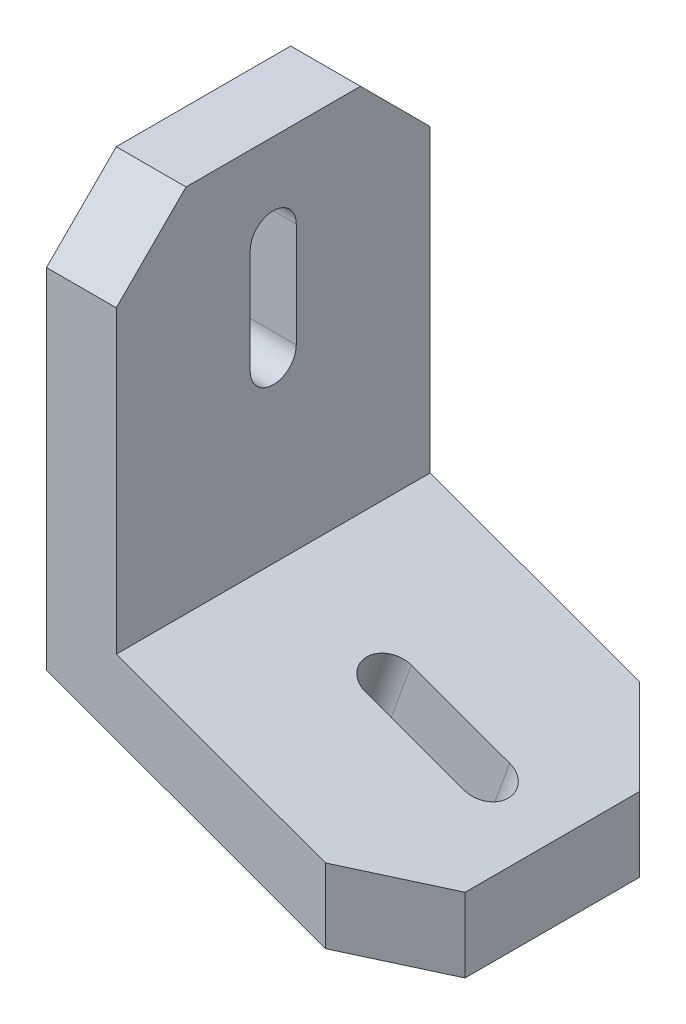
ISO-10303-21;
HEADER;
FILE_DESCRIPTION(('STEP AP214'),'2;1');
FILE_NAME('part.step','',(''),(''),'','','');
FILE_SCHEMA(('AUTOMOTIVE_DESIGN { 1 0 10303 214 1 1 1 1 }'));
ENDSEC;
DATA;
#1=APPLICATION_CONTEXT('core data for automotive mechanical design processes');
#2=APPLICATION_PROTOCOL_DEFINITION('international standard','automotive_design',2000,#1);
#3=PRODUCT_CONTEXT('',#1,'mechanical');
#4=PRODUCT('Part','Part','',(#3));
#5=PRODUCT_RELATED_PRODUCT_CATEGORY('part','',(#4));
#6=PRODUCT_DEFINITION_FORMATION('','',#4);
#7=PRODUCT_DEFINITION_CONTEXT('part definition',#1,'design');
#8=PRODUCT_DEFINITION('design','',#6,#7);
#9=PRODUCT_DEFINITION_SHAPE('','',#8);
#10=(LENGTH_UNIT() NAMED_UNIT(*) SI_UNIT(.MILLI.,.METRE.));
#11=(NAMED_UNIT(*) PLANE_ANGLE_UNIT() SI_UNIT($,.RADIAN.));
#12=(NAMED_UNIT(*) SI_UNIT($,.STERADIAN.) SOLID_ANGLE_UNIT());
#13=UNCERTAINTY_MEASURE_WITH_UNIT(LENGTH_MEASURE(1.E-05),#10,'distance_accuracy_value','');
#14=(GEOMETRIC_REPRESENTATION_CONTEXT(3) GLOBAL_UNCERTAINTY_ASSIGNED_CONTEXT((#13)) GLOBAL_UNIT_ASSIGNED_CONTEXT((#10,
#11,#12)) REPRESENTATION_CONTEXT('',''));
#15=CARTESIAN_POINT('',(0.,0.,0.));
#16=DIRECTION('',(0.,0.,1.));
#17=DIRECTION('',(1.,0.,0.));
#18=AXIS2_PLACEMENT_3D('',#15,#16,#17);
#19=CARTESIAN_POINT('',(0.,0.,22.5));
#20=DIRECTION('',(-1.,0.,0.));
#21=DIRECTION('',(0.,0.,1.));
#22=AXIS2_PLACEMENT_3D('',#19,#20,#21);
#23=PLANE('',#22);
#24=CARTESIAN_POINT('',(0.,47.5,0.));
#25=DIRECTION('',(-1.,0.,0.));
#26=DIRECTION('',(0.,0.,1.));
#27=AXIS2_PLACEMENT_3D('',#24,#25,#26);
#28=CIRCLE('',#27,3.29999999999998);
#29=CARTESIAN_POINT('',(0.,47.5,3.30000000000003));
#30=VERTEX_POINT('',#29);
#31=CARTESIAN_POINT('',(0.,47.5,-3.29999999999998));
#32=VERTEX_POINT('',#31);
#33=EDGE_CURVE('E358',#30,#32,#28,.T.);
#34=ORIENTED_EDGE('',*,*,#33,.F.);
#35=DIRECTION('',(0.,1.,0.));
#36=VECTOR('',#35,1.);
#37=CARTESIAN_POINT('',(0.,32.5,3.30000000000003));
#38=LINE('',#37,#36);
#39=CARTESIAN_POINT('',(0.,32.5,3.29999999999998));
#40=VERTEX_POINT('',#39);
#41=EDGE_CURVE('E342',#40,#30,#38,.T.);
#42=ORIENTED_EDGE('',*,*,#41,.F.);
#43=CARTESIAN_POINT('',(0.,32.5,0.));
#44=DIRECTION('',(-1.,0.,0.));
#45=DIRECTION('',(0.,0.,1.));
#46=AXIS2_PLACEMENT_3D('',#43,#44,#45);
#47=CIRCLE('',#46,3.29999999999998);
#48=CARTESIAN_POINT('',(0.,32.5,-3.29999999999998));
#49=VERTEX_POINT('',#48);
#50=EDGE_CURVE('E350',#49,#40,#47,.T.);
#51=ORIENTED_EDGE('',*,*,#50,.F.);
#52=DIRECTION('',(0.,1.,0.));
#53=VECTOR('',#52,1.);
#54=CARTESIAN_POINT('',(0.,32.5,-3.29999999999998));
#55=LINE('',#54,#53);
#56=EDGE_CURVE('E347',#49,#32,#55,.T.);
#57=ORIENTED_EDGE('',*,*,#56,.T.);
#58=EDGE_LOOP('',(#34,#42,#51,#57));
#59=FACE_BOUND('',#58,.T.);
#60=DIRECTION('',(0.,1.,0.));
#61=VECTOR('',#60,1.);
#62=CARTESIAN_POINT('',(0.,0.,22.5));
#63=LINE('',#62,#61);
#64=CARTESIAN_POINT('',(0.,0.,22.5));
#65=VERTEX_POINT('',#64);
#66=CARTESIAN_POINT('',(0.,50.,22.5));
#67=VERTEX_POINT('',#66);
#68=EDGE_CURVE('E366',#65,#67,#63,.T.);
#69=ORIENTED_EDGE('',*,*,#68,.T.);
#70=DIRECTION('',(0.,0.707106781186547,-0.707106781186549));
#71=VECTOR('',#70,1.);
#72=CARTESIAN_POINT('',(0.,25.0000000000001,47.5));
#73=LINE('',#72,#71);
#74=CARTESIAN_POINT('',(0.,60.,12.5));
#75=VERTEX_POINT('',#74);
#76=EDGE_CURVE('E448',#67,#75,#73,.T.);
#77=ORIENTED_EDGE('',*,*,#76,.T.);
#78=DIRECTION('',(0.,0.,-1.));
#79=VECTOR('',#78,1.);
#80=CARTESIAN_POINT('',(0.,60.,22.5));
#81=LINE('',#80,#79);
#82=CARTESIAN_POINT('',(0.,60.,-12.5));
#83=VERTEX_POINT('',#82);
#84=EDGE_CURVE('E378',#75,#83,#81,.T.);
#85=ORIENTED_EDGE('',*,*,#84,.T.);
#86=DIRECTION('',(0.,0.707106781186549,0.707106781186546));
#87=VECTOR('',#86,1.);
#88=CARTESIAN_POINT('',(0.,47.4999999999999,-25.0000000000001));
#89=LINE('',#88,#87);
#90=CARTESIAN_POINT('',(0.,50.,-22.5));
#91=VERTEX_POINT('',#90);
#92=EDGE_CURVE('E446',#83,#91,#89,.F.);
#93=ORIENTED_EDGE('',*,*,#92,.T.);
#94=DIRECTION('',(0.,1.,0.));
#95=VECTOR('',#94,1.);
#96=CARTESIAN_POINT('',(0.,0.,-22.5));
#97=LINE('',#96,#95);
#98=CARTESIAN_POINT('',(0.,0.,-22.5));
#99=VERTEX_POINT('',#98);
#100=EDGE_CURVE('E365',#99,#91,#97,.T.);
#101=ORIENTED_EDGE('',*,*,#100,.F.);
#102=DIRECTION('',(0.,0.,-1.));
#103=VECTOR('',#102,1.);
#104=CARTESIAN_POINT('',(0.,0.,22.5));
#105=LINE('',#104,#103);
#106=EDGE_CURVE('E387',#65,#99,#105,.T.);
#107=ORIENTED_EDGE('',*,*,#106,.F.);
#108=EDGE_LOOP('',(#69,#77,#85,#93,#101,#107));
#109=FACE_BOUND('',#108,.T.);
#110=ADVANCED_FACE('F189',(#59,#109),#23,.T.);
#111=CARTESIAN_POINT('',(0.,0.,22.5));
#112=DIRECTION('',(0.342020143325666,0.93969262078591,0.));
#113=DIRECTION('',(-0.93969262078591,0.342020143325666,0.));
#114=AXIS2_PLACEMENT_3D('',#111,#112,#113);
#115=PLANE('',#114);
#116=CARTESIAN_POINT('',(37.1828723588843,-13.5334587631533,0.));
#117=DIRECTION('',(0.342020143325666,0.93969262078591,0.));
#118=DIRECTION('',(-0.93969262078591,0.342020143325666,0.));
#119=AXIS2_PLACEMENT_3D('',#116,#117,#118);
#120=CIRCLE('',#119,3.3);
#121=CARTESIAN_POINT('',(37.1828723588843,-13.5334587631533,3.3));
#122=VERTEX_POINT('',#121);
#123=CARTESIAN_POINT('',(37.1828723588843,-13.5334587631533,-3.3));
#124=VERTEX_POINT('',#123);
#125=EDGE_CURVE('E334',#122,#124,#120,.T.);
#126=ORIENTED_EDGE('',*,*,#125,.T.);
#127=DIRECTION('',(-0.93969262078591,0.342020143325666,0.));
#128=VECTOR('',#127,1.);
#129=CARTESIAN_POINT('',(0.,0.,-3.3));
#130=LINE('',#129,#128);
#131=CARTESIAN_POINT('',(23.0874830470956,-8.40315661326829,-3.3));
#132=VERTEX_POINT('',#131);
#133=EDGE_CURVE('E420',#124,#132,#130,.T.);
#134=ORIENTED_EDGE('',*,*,#133,.T.);
#135=CARTESIAN_POINT('',(23.0874830470956,-8.40315661326828,0.));
#136=DIRECTION('',(0.342020143325666,0.93969262078591,0.));
#137=DIRECTION('',(-0.93969262078591,0.342020143325666,0.));
#138=AXIS2_PLACEMENT_3D('',#135,#136,#137);
#139=CIRCLE('',#138,3.3);
#140=CARTESIAN_POINT('',(23.0874830470956,-8.40315661326828,3.3));
#141=VERTEX_POINT('',#140);
#142=EDGE_CURVE('E416',#132,#141,#139,.T.);
#143=ORIENTED_EDGE('',*,*,#142,.T.);
#144=DIRECTION('',(0.93969262078591,-0.342020143325666,0.));
#145=VECTOR('',#144,1.);
#146=CARTESIAN_POINT('',(0.,0.,3.3));
#147=LINE('',#146,#145);
#148=EDGE_CURVE('E414',#141,#122,#147,.T.);
#149=ORIENTED_EDGE('',*,*,#148,.T.);
#150=EDGE_LOOP('',(#126,#134,#143,#149));
#151=FACE_BOUND('',#150,.T.);
#152=DIRECTION('',(0.939692620785909,-0.342020143325666,0.));
#153=VECTOR('',#152,1.);
#154=CARTESIAN_POINT('',(0.,0.,-22.5));
#155=LINE('',#154,#153);
#156=CARTESIAN_POINT('',(40.,-14.5588093706479,-22.5));
#157=VERTEX_POINT('',#156);
#158=EDGE_CURVE('E370',#99,#157,#155,.T.);
#159=ORIENTED_EDGE('',*,*,#158,.T.);
#160=DIRECTION('',(-0.684791078771738,0.249243569363952,-0.684791078771735));
#161=VECTOR('',#160,1.);
#162=CARTESIAN_POINT('',(50.,-18.1985117133099,-12.5));
#163=LINE('',#162,#161);
#164=CARTESIAN_POINT('',(50.,-18.1985117133099,-12.5));
#165=VERTEX_POINT('',#164);
#166=EDGE_CURVE('E438',#157,#165,#163,.F.);
#167=ORIENTED_EDGE('',*,*,#166,.T.);
#168=DIRECTION('',(0.,0.,-1.));
#169=VECTOR('',#168,1.);
#170=CARTESIAN_POINT('',(50.,-18.1985117133099,22.5));
#171=LINE('',#170,#169);
#172=CARTESIAN_POINT('',(50.,-18.1985117133099,12.5));
#173=VERTEX_POINT('',#172);
#174=EDGE_CURVE('E390',#173,#165,#171,.T.);
#175=ORIENTED_EDGE('',*,*,#174,.F.);
#176=DIRECTION('',(-0.684791078771736,0.249243569363951,0.684791078771737));
#177=VECTOR('',#176,1.);
#178=CARTESIAN_POINT('',(37.5151057252287,-13.6543818193327,24.9848942747713));
#179=LINE('',#178,#177);
#180=CARTESIAN_POINT('',(40.,-14.5588093706479,22.5));
#181=VERTEX_POINT('',#180);
#182=EDGE_CURVE('E436',#173,#181,#179,.T.);
#183=ORIENTED_EDGE('',*,*,#182,.T.);
#184=DIRECTION('',(0.939692620785909,-0.342020143325666,0.));
#185=VECTOR('',#184,1.);
#186=CARTESIAN_POINT('',(0.,0.,22.5));
#187=LINE('',#186,#185);
#188=EDGE_CURVE('E375',#65,#181,#187,.T.);
#189=ORIENTED_EDGE('',*,*,#188,.F.);
#190=ORIENTED_EDGE('',*,*,#106,.T.);
#191=EDGE_LOOP('',(#159,#167,#175,#183,#189,#190));
#192=FACE_BOUND('',#191,.T.);
#193=ADVANCED_FACE('F482',(#151,#192),#115,.F.);
#194=CARTESIAN_POINT('',(50.,-18.1985117133099,22.5));
#195=DIRECTION('',(-1.,0.,0.));
#196=DIRECTION('',(0.,0.,1.));
#197=AXIS2_PLACEMENT_3D('',#194,#195,#196);
#198=PLANE('',#197);
#199=ORIENTED_EDGE('',*,*,#174,.T.);
#200=DIRECTION('',(0.,1.,0.));
#201=VECTOR('',#200,1.);
#202=CARTESIAN_POINT('',(50.,-18.1985117133099,-12.5));
#203=LINE('',#202,#201);
#204=CARTESIAN_POINT('',(50.,-7.55673398855083,-12.5));
#205=VERTEX_POINT('',#204);
#206=EDGE_CURVE('E425',#165,#205,#203,.T.);
#207=ORIENTED_EDGE('',*,*,#206,.T.);
#208=DIRECTION('',(0.,0.,-1.));
#209=VECTOR('',#208,1.);
#210=CARTESIAN_POINT('',(50.,-7.55673398855083,22.5));
#211=LINE('',#210,#209);
#212=CARTESIAN_POINT('',(50.,-7.55673398855083,12.5));
#213=VERTEX_POINT('',#212);
#214=EDGE_CURVE('E393',#213,#205,#211,.T.);
#215=ORIENTED_EDGE('',*,*,#214,.F.);
#216=DIRECTION('',(0.,-1.,0.));
#217=VECTOR('',#216,1.);
#218=CARTESIAN_POINT('',(50.,-18.1985117133099,12.4999999999999));
#219=LINE('',#218,#217);
#220=EDGE_CURVE('E423',#213,#173,#219,.T.);
#221=ORIENTED_EDGE('',*,*,#220,.T.);
#222=EDGE_LOOP('',(#199,#207,#215,#221));
#223=FACE_BOUND('',#222,.T.);
#224=ADVANCED_FACE('F489',(#223),#198,.F.);
#225=CARTESIAN_POINT('',(50.,-7.55673398855083,22.5));
#226=DIRECTION('',(-0.342020143325666,-0.939692620785909,0.));
#227=DIRECTION('',(0.93969262078591,-0.342020143325666,0.));
#228=AXIS2_PLACEMENT_3D('',#225,#226,#227);
#229=PLANE('',#228);
#230=DIRECTION('',(0.939692620785909,-0.342020143325666,0.));
#231=VECTOR('',#230,1.);
#232=CARTESIAN_POINT('',(26.5076844803523,0.993769594590824,-3.3));
#233=LINE('',#232,#231);
#234=CARTESIAN_POINT('',(26.5076844803523,0.993769594590823,-3.30000000000003));
#235=VERTEX_POINT('',#234);
#236=CARTESIAN_POINT('',(40.6030737921409,-4.13653255529418,-3.3));
#237=VERTEX_POINT('',#236);
#238=EDGE_CURVE('E326',#235,#237,#233,.T.);
#239=ORIENTED_EDGE('',*,*,#238,.T.);
#240=CARTESIAN_POINT('',(40.6030737921409,-4.13653255529416,0.));
#241=DIRECTION('',(0.342020143325666,0.93969262078591,0.));
#242=DIRECTION('',(-0.93969262078591,0.342020143325666,0.));
#243=AXIS2_PLACEMENT_3D('',#240,#241,#242);
#244=CIRCLE('',#243,3.3);
#245=CARTESIAN_POINT('',(40.6030737921409,-4.13653255529416,3.30000000000003));
#246=VERTEX_POINT('',#245);
#247=EDGE_CURVE('E331',#246,#237,#244,.T.);
#248=ORIENTED_EDGE('',*,*,#247,.F.);
#249=DIRECTION('',(0.939692620785909,-0.342020143325666,0.));
#250=VECTOR('',#249,1.);
#251=CARTESIAN_POINT('',(26.5076844803523,0.993769594590824,3.30000000000003));
#252=LINE('',#251,#250);
#253=CARTESIAN_POINT('',(26.5076844803523,0.993769594590823,3.3));
#254=VERTEX_POINT('',#253);
#255=EDGE_CURVE('E316',#254,#246,#252,.T.);
#256=ORIENTED_EDGE('',*,*,#255,.F.);
#257=CARTESIAN_POINT('',(26.5076844803523,0.993769594590823,0.));
#258=DIRECTION('',(0.342020143325666,0.93969262078591,0.));
#259=DIRECTION('',(-0.93969262078591,0.342020143325666,0.));
#260=AXIS2_PLACEMENT_3D('',#257,#258,#259);
#261=CIRCLE('',#260,3.3);
#262=EDGE_CURVE('E686',#235,#254,#261,.T.);
#263=ORIENTED_EDGE('',*,*,#262,.F.);
#264=EDGE_LOOP('',(#239,#248,#256,#263));
#265=FACE_BOUND('',#264,.T.);
#266=ORIENTED_EDGE('',*,*,#214,.T.);
#267=DIRECTION('',(0.684791078771738,-0.249243569363952,0.684791078771735));
#268=VECTOR('',#267,1.);
#269=CARTESIAN_POINT('',(51.8163362036291,-8.21782630209191,-10.6836637963709));
#270=LINE('',#269,#268);
#271=CARTESIAN_POINT('',(40.,-3.91703164588883,-22.5));
#272=VERTEX_POINT('',#271);
#273=EDGE_CURVE('E430',#205,#272,#270,.F.);
#274=ORIENTED_EDGE('',*,*,#273,.T.);
#275=DIRECTION('',(-0.939692620785909,0.342020143325666,0.));
#276=VECTOR('',#275,1.);
#277=CARTESIAN_POINT('',(50.,-7.55673398855083,-22.5));
#278=LINE('',#277,#276);
#279=CARTESIAN_POINT('',(10.,7.00207538209712,-22.5));
#280=VERTEX_POINT('',#279);
#281=EDGE_CURVE('E383',#272,#280,#278,.T.);
#282=ORIENTED_EDGE('',*,*,#281,.T.);
#283=DIRECTION('',(0.,0.,-1.));
#284=VECTOR('',#283,1.);
#285=CARTESIAN_POINT('',(10.,7.00207538209712,22.5));
#286=LINE('',#285,#284);
#287=CARTESIAN_POINT('',(10.,7.00207538209712,22.5));
#288=VERTEX_POINT('',#287);
#289=EDGE_CURVE('E396',#288,#280,#286,.T.);
#290=ORIENTED_EDGE('',*,*,#289,.F.);
#291=DIRECTION('',(-0.939692620785909,0.342020143325666,0.));
#292=VECTOR('',#291,1.);
#293=CARTESIAN_POINT('',(50.,-7.55673398855083,22.5));
#294=LINE('',#293,#292);
#295=CARTESIAN_POINT('',(40.,-3.91703164588884,22.5));
#296=VERTEX_POINT('',#295);
#297=EDGE_CURVE('E373',#296,#288,#294,.T.);
#298=ORIENTED_EDGE('',*,*,#297,.F.);
#299=DIRECTION('',(0.684791078771735,-0.249243569363952,-0.684791078771737));
#300=VECTOR('',#299,1.);
#301=CARTESIAN_POINT('',(39.3314419288578,-3.67369640811465,23.1685580711422));
#302=LINE('',#301,#300);
#303=EDGE_CURVE('E428',#296,#213,#302,.T.);
#304=ORIENTED_EDGE('',*,*,#303,.T.);
#305=EDGE_LOOP('',(#266,#274,#282,#290,#298,#304));
#306=FACE_BOUND('',#305,.T.);
#307=ADVANCED_FACE('F338',(#265,#306),#229,.F.);
#308=CARTESIAN_POINT('',(10.,7.00207538209712,22.5));
#309=DIRECTION('',(-1.,0.,0.));
#310=DIRECTION('',(0.,-1.,0.));
#311=AXIS2_PLACEMENT_3D('',#308,#309,#310);
#312=PLANE('',#311);
#313=CARTESIAN_POINT('',(10.,47.5,0.));
#314=DIRECTION('',(-1.,0.,0.));
#315=DIRECTION('',(0.,-1.,0.));
#316=AXIS2_PLACEMENT_3D('',#313,#314,#315);
#317=CIRCLE('',#316,3.29999999999999);
#318=CARTESIAN_POINT('',(10.,47.5,3.29999999999999));
#319=VERTEX_POINT('',#318);
#320=CARTESIAN_POINT('',(10.,47.5,-3.29999999999999));
#321=VERTEX_POINT('',#320);
#322=EDGE_CURVE('E408',#319,#321,#317,.T.);
#323=ORIENTED_EDGE('',*,*,#322,.T.);
#324=DIRECTION('',(0.,-1.,0.));
#325=VECTOR('',#324,1.);
#326=CARTESIAN_POINT('',(10.,7.00207538209712,-3.29999999999999));
#327=LINE('',#326,#325);
#328=CARTESIAN_POINT('',(10.,32.5,-3.29999999999999));
#329=VERTEX_POINT('',#328);
#330=EDGE_CURVE('E411',#321,#329,#327,.T.);
#331=ORIENTED_EDGE('',*,*,#330,.T.);
#332=CARTESIAN_POINT('',(10.,32.5,0.));
#333=DIRECTION('',(-1.,0.,0.));
#334=DIRECTION('',(0.,-1.,0.));
#335=AXIS2_PLACEMENT_3D('',#332,#333,#334);
#336=CIRCLE('',#335,3.29999999999999);
#337=CARTESIAN_POINT('',(10.,32.5,3.29999999999999));
#338=VERTEX_POINT('',#337);
#339=EDGE_CURVE('E405',#329,#338,#336,.T.);
#340=ORIENTED_EDGE('',*,*,#339,.T.);
#341=DIRECTION('',(0.,1.,0.));
#342=VECTOR('',#341,1.);
#343=CARTESIAN_POINT('',(10.,7.00207538209712,3.29999999999999));
#344=LINE('',#343,#342);
#345=EDGE_CURVE('E389',#338,#319,#344,.T.);
#346=ORIENTED_EDGE('',*,*,#345,.T.);
#347=EDGE_LOOP('',(#323,#331,#340,#346));
#348=FACE_BOUND('',#347,.T.);
#349=DIRECTION('',(0.,0.,-1.));
#350=VECTOR('',#349,1.);
#351=CARTESIAN_POINT('',(10.,60.,22.5));
#352=LINE('',#351,#350);
#353=CARTESIAN_POINT('',(10.,60.,12.5));
#354=VERTEX_POINT('',#353);
#355=CARTESIAN_POINT('',(10.,60.,-12.5));
#356=VERTEX_POINT('',#355);
#357=EDGE_CURVE('E399',#354,#356,#352,.T.);
#358=ORIENTED_EDGE('',*,*,#357,.F.);
#359=DIRECTION('',(0.,-0.707106781186547,0.707106781186549));
#360=VECTOR('',#359,1.);
#361=CARTESIAN_POINT('',(10.,50.,22.5));
#362=LINE('',#361,#360);
#363=CARTESIAN_POINT('',(10.,50.,22.5));
#364=VERTEX_POINT('',#363);
#365=EDGE_CURVE('E13',#354,#364,#362,.T.);
#366=ORIENTED_EDGE('',*,*,#365,.T.);
#367=DIRECTION('',(0.,1.,0.));
#368=VECTOR('',#367,1.);
#369=CARTESIAN_POINT('',(10.,7.00207538209712,22.5));
#370=LINE('',#369,#368);
#371=EDGE_CURVE('E369',#288,#364,#370,.T.);
#372=ORIENTED_EDGE('',*,*,#371,.F.);
#373=ORIENTED_EDGE('',*,*,#289,.T.);
#374=DIRECTION('',(0.,1.,0.));
#375=VECTOR('',#374,1.);
#376=CARTESIAN_POINT('',(10.,7.00207538209712,-22.5));
#377=LINE('',#376,#375);
#378=CARTESIAN_POINT('',(10.,50.,-22.5));
#379=VERTEX_POINT('',#378);
#380=EDGE_CURVE('E381',#280,#379,#377,.T.);
#381=ORIENTED_EDGE('',*,*,#380,.T.);
#382=DIRECTION('',(0.,-0.707106781186549,-0.707106781186546));
#383=VECTOR('',#382,1.);
#384=CARTESIAN_POINT('',(10.,60.,-12.5));
#385=LINE('',#384,#383);
#386=EDGE_CURVE('E198',#379,#356,#385,.F.);
#387=ORIENTED_EDGE('',*,*,#386,.T.);
#388=EDGE_LOOP('',(#358,#366,#372,#373,#381,#387));
#389=FACE_BOUND('',#388,.T.);
#390=ADVANCED_FACE('F468',(#348,#389),#312,.F.);
#391=CARTESIAN_POINT('',(10.,60.,22.5));
#392=DIRECTION('',(0.,-1.,0.));
#393=DIRECTION('',(0.,0.,-1.));
#394=AXIS2_PLACEMENT_3D('',#391,#392,#393);
#395=PLANE('',#394);
#396=ORIENTED_EDGE('',*,*,#84,.F.);
#397=DIRECTION('',(1.,0.,0.));
#398=VECTOR('',#397,1.);
#399=CARTESIAN_POINT('',(10.,60.,12.5));
#400=LINE('',#399,#398);
#401=EDGE_CURVE('E211',#75,#354,#400,.T.);
#402=ORIENTED_EDGE('',*,*,#401,.T.);
#403=ORIENTED_EDGE('',*,*,#357,.T.);
#404=DIRECTION('',(-1.,0.,0.));
#405=VECTOR('',#404,1.);
#406=CARTESIAN_POINT('',(10.,60.,-12.5));
#407=LINE('',#406,#405);
#408=EDGE_CURVE('E450',#356,#83,#407,.T.);
#409=ORIENTED_EDGE('',*,*,#408,.T.);
#410=EDGE_LOOP('',(#396,#402,#403,#409));
#411=FACE_BOUND('',#410,.T.);
#412=ADVANCED_FACE('F454',(#411),#395,.F.);
#413=CARTESIAN_POINT('',(0.,0.,22.5));
#414=DIRECTION('',(0.,0.,1.));
#415=DIRECTION('',(1.,0.,0.));
#416=AXIS2_PLACEMENT_3D('',#413,#414,#415);
#417=PLANE('',#416);
#418=ORIENTED_EDGE('',*,*,#188,.T.);
#419=DIRECTION('',(0.,1.,0.));
#420=VECTOR('',#419,1.);
#421=CARTESIAN_POINT('',(40.,-7.55673398855083,22.5));
#422=LINE('',#421,#420);
#423=EDGE_CURVE('E443',#181,#296,#422,.T.);
#424=ORIENTED_EDGE('',*,*,#423,.T.);
#425=ORIENTED_EDGE('',*,*,#297,.T.);
#426=ORIENTED_EDGE('',*,*,#371,.T.);
#427=DIRECTION('',(-1.,0.,0.));
#428=VECTOR('',#427,1.);
#429=CARTESIAN_POINT('',(0.,50.,22.5));
#430=LINE('',#429,#428);
#431=EDGE_CURVE('E440',#364,#67,#430,.T.);
#432=ORIENTED_EDGE('',*,*,#431,.T.);
#433=ORIENTED_EDGE('',*,*,#68,.F.);
#434=EDGE_LOOP('',(#418,#424,#425,#426,#432,#433));
#435=FACE_BOUND('',#434,.T.);
#436=ADVANCED_FACE('F464',(#435),#417,.T.);
#437=CARTESIAN_POINT('',(0.,0.,-22.5));
#438=DIRECTION('',(0.,0.,1.));
#439=DIRECTION('',(1.,0.,0.));
#440=AXIS2_PLACEMENT_3D('',#437,#438,#439);
#441=PLANE('',#440);
#442=ORIENTED_EDGE('',*,*,#281,.F.);
#443=DIRECTION('',(0.,-1.,0.));
#444=VECTOR('',#443,1.);
#445=CARTESIAN_POINT('',(40.,0.,-22.5));
#446=LINE('',#445,#444);
#447=EDGE_CURVE('E434',#272,#157,#446,.T.);
#448=ORIENTED_EDGE('',*,*,#447,.T.);
#449=ORIENTED_EDGE('',*,*,#158,.F.);
#450=ORIENTED_EDGE('',*,*,#100,.T.);
#451=DIRECTION('',(1.,0.,0.));
#452=VECTOR('',#451,1.);
#453=CARTESIAN_POINT('',(0.,50.,-22.5));
#454=LINE('',#453,#452);
#455=EDGE_CURVE('E432',#91,#379,#454,.T.);
#456=ORIENTED_EDGE('',*,*,#455,.T.);
#457=ORIENTED_EDGE('',*,*,#380,.F.);
#458=EDGE_LOOP('',(#442,#448,#449,#450,#456,#457));
#459=FACE_BOUND('',#458,.T.);
#460=ADVANCED_FACE('F472',(#459),#441,.F.);
#461=CARTESIAN_POINT('',(0.,47.5,0.));
#462=DIRECTION('',(-1.,0.,0.));
#463=DIRECTION('',(0.,0.,1.));
#464=AXIS2_PLACEMENT_3D('',#461,#462,#463);
#465=CYLINDRICAL_SURFACE('',#464,3.29999999999999);
#466=DIRECTION('',(-1.,0.,0.));
#467=VECTOR('',#466,1.);
#468=CARTESIAN_POINT('',(0.,47.5,3.29999999999999));
#469=LINE('',#468,#467);
#470=EDGE_CURVE('E363',#30,#319,#469,.F.);
#471=ORIENTED_EDGE('',*,*,#470,.F.);
#472=ORIENTED_EDGE('',*,*,#33,.T.);
#473=DIRECTION('',(-1.,0.,0.));
#474=VECTOR('',#473,1.);
#475=CARTESIAN_POINT('',(0.,47.5,-3.29999999999999));
#476=LINE('',#475,#474);
#477=EDGE_CURVE('E361',#321,#32,#476,.T.);
#478=ORIENTED_EDGE('',*,*,#477,.F.);
#479=ORIENTED_EDGE('',*,*,#322,.F.);
#480=EDGE_LOOP('',(#471,#472,#478,#479));
#481=FACE_BOUND('',#480,.T.);
#482=ADVANCED_FACE('F541',(#481),#465,.F.);
#483=CARTESIAN_POINT('',(0.,32.5,0.));
#484=DIRECTION('',(-1.,0.,0.));
#485=DIRECTION('',(0.,0.,1.));
#486=AXIS2_PLACEMENT_3D('',#483,#484,#485);
#487=CYLINDRICAL_SURFACE('',#486,3.29999999999999);
#488=DIRECTION('',(-1.,0.,0.));
#489=VECTOR('',#488,1.);
#490=CARTESIAN_POINT('',(0.,32.5,-3.29999999999999));
#491=LINE('',#490,#489);
#492=EDGE_CURVE('E355',#49,#329,#491,.F.);
#493=ORIENTED_EDGE('',*,*,#492,.F.);
#494=ORIENTED_EDGE('',*,*,#50,.T.);
#495=DIRECTION('',(-1.,0.,0.));
#496=VECTOR('',#495,1.);
#497=CARTESIAN_POINT('',(0.,32.5,3.29999999999999));
#498=LINE('',#497,#496);
#499=EDGE_CURVE('E353',#338,#40,#498,.T.);
#500=ORIENTED_EDGE('',*,*,#499,.F.);
#501=ORIENTED_EDGE('',*,*,#339,.F.);
#502=EDGE_LOOP('',(#493,#494,#500,#501));
#503=FACE_BOUND('',#502,.T.);
#504=ADVANCED_FACE('F547',(#503),#487,.F.);
#505=CARTESIAN_POINT('',(0.,32.5,-3.29999999999999));
#506=DIRECTION('',(0.,0.,-1.));
#507=DIRECTION('',(0.,1.,0.));
#508=AXIS2_PLACEMENT_3D('',#505,#506,#507);
#509=PLANE('',#508);
#510=ORIENTED_EDGE('',*,*,#477,.T.);
#511=ORIENTED_EDGE('',*,*,#56,.F.);
#512=ORIENTED_EDGE('',*,*,#492,.T.);
#513=ORIENTED_EDGE('',*,*,#330,.F.);
#514=EDGE_LOOP('',(#510,#511,#512,#513));
#515=FACE_BOUND('',#514,.T.);
#516=ADVANCED_FACE('F544',(#515),#509,.F.);
#517=CARTESIAN_POINT('',(0.,32.5,3.29999999999999));
#518=DIRECTION('',(0.,0.,1.));
#519=DIRECTION('',(0.,-1.,0.));
#520=AXIS2_PLACEMENT_3D('',#517,#518,#519);
#521=PLANE('',#520);
#522=ORIENTED_EDGE('',*,*,#499,.T.);
#523=ORIENTED_EDGE('',*,*,#41,.T.);
#524=ORIENTED_EDGE('',*,*,#470,.T.);
#525=ORIENTED_EDGE('',*,*,#345,.F.);
#526=EDGE_LOOP('',(#522,#523,#524,#525));
#527=FACE_BOUND('',#526,.T.);
#528=ADVANCED_FACE('F551',(#527),#521,.F.);
#529=CARTESIAN_POINT('',(40.6030737921409,-4.13653255529416,0.));
#530=DIRECTION('',(0.342020143325666,0.93969262078591,0.));
#531=DIRECTION('',(-0.93969262078591,0.342020143325666,0.));
#532=AXIS2_PLACEMENT_3D('',#529,#530,#531);
#533=CYLINDRICAL_SURFACE('',#532,3.3);
#534=DIRECTION('',(-0.342020143325665,-0.93969262078591,0.));
#535=VECTOR('',#534,1.);
#536=CARTESIAN_POINT('',(31.3335450652755,-29.604353421343,3.3));
#537=LINE('',#536,#535);
#538=EDGE_CURVE('E319',#246,#122,#537,.T.);
#539=ORIENTED_EDGE('',*,*,#538,.F.);
#540=ORIENTED_EDGE('',*,*,#247,.T.);
#541=DIRECTION('',(0.342020143325666,0.93969262078591,0.));
#542=VECTOR('',#541,1.);
#543=CARTESIAN_POINT('',(40.6030737921409,-4.13653255529416,-3.3));
#544=LINE('',#543,#542);
#545=EDGE_CURVE('E340',#124,#237,#544,.T.);
#546=ORIENTED_EDGE('',*,*,#545,.F.);
#547=ORIENTED_EDGE('',*,*,#125,.F.);
#548=EDGE_LOOP('',(#539,#540,#546,#547));
#549=FACE_BOUND('',#548,.T.);
#550=ADVANCED_FACE('F329',(#549),#533,.F.);
#551=CARTESIAN_POINT('',(26.5076844803523,0.993769594590823,0.));
#552=DIRECTION('',(0.342020143325666,0.93969262078591,0.));
#553=DIRECTION('',(-0.93969262078591,0.342020143325666,0.));
#554=AXIS2_PLACEMENT_3D('',#551,#552,#553);
#555=CYLINDRICAL_SURFACE('',#554,3.3);
#556=DIRECTION('',(0.342020143325666,0.93969262078591,0.));
#557=VECTOR('',#556,1.);
#558=CARTESIAN_POINT('',(26.5076844803523,0.993769594590821,-3.3));
#559=LINE('',#558,#557);
#560=EDGE_CURVE('E335',#235,#132,#559,.F.);
#561=ORIENTED_EDGE('',*,*,#560,.F.);
#562=ORIENTED_EDGE('',*,*,#262,.T.);
#563=DIRECTION('',(-0.342020143325665,-0.93969262078591,0.));
#564=VECTOR('',#563,1.);
#565=CARTESIAN_POINT('',(17.2381557534869,-24.474051271458,3.3));
#566=LINE('',#565,#564);
#567=EDGE_CURVE('E322',#254,#141,#566,.T.);
#568=ORIENTED_EDGE('',*,*,#567,.T.);
#569=ORIENTED_EDGE('',*,*,#142,.F.);
#570=EDGE_LOOP('',(#561,#562,#568,#569));
#571=FACE_BOUND('',#570,.T.);
#572=ADVANCED_FACE('F558',(#571),#555,.F.);
#573=CARTESIAN_POINT('',(26.5076844803523,0.993769594590821,-3.3));
#574=DIRECTION('',(0.,0.,-1.));
#575=DIRECTION('',(-1.,0.,0.));
#576=AXIS2_PLACEMENT_3D('',#573,#574,#575);
#577=PLANE('',#576);
#578=ORIENTED_EDGE('',*,*,#545,.T.);
#579=ORIENTED_EDGE('',*,*,#238,.F.);
#580=ORIENTED_EDGE('',*,*,#560,.T.);
#581=ORIENTED_EDGE('',*,*,#133,.F.);
#582=EDGE_LOOP('',(#578,#579,#580,#581));
#583=FACE_BOUND('',#582,.T.);
#584=ADVANCED_FACE('F602',(#583),#577,.F.);
#585=CARTESIAN_POINT('',(17.2381557534869,-24.474051271458,3.3));
#586=DIRECTION('',(0.,0.,1.));
#587=DIRECTION('',(0.,-1.,0.));
#588=AXIS2_PLACEMENT_3D('',#585,#586,#587);
#589=PLANE('',#588);
#590=ORIENTED_EDGE('',*,*,#567,.F.);
#591=ORIENTED_EDGE('',*,*,#255,.T.);
#592=ORIENTED_EDGE('',*,*,#538,.T.);
#593=ORIENTED_EDGE('',*,*,#148,.F.);
#594=EDGE_LOOP('',(#590,#591,#592,#593));
#595=FACE_BOUND('',#594,.T.);
#596=ADVANCED_FACE('F318',(#595),#589,.F.);
#597=CARTESIAN_POINT('',(50.,-18.1985117133099,-12.5));
#598=DIRECTION('',(-0.707106781186546,0.,0.707106781186549));
#599=DIRECTION('',(0.,1.,0.));
#600=AXIS2_PLACEMENT_3D('',#597,#598,#599);
#601=PLANE('',#600);
#602=ORIENTED_EDGE('',*,*,#166,.F.);
#603=ORIENTED_EDGE('',*,*,#447,.F.);
#604=ORIENTED_EDGE('',*,*,#273,.F.);
#605=ORIENTED_EDGE('',*,*,#206,.F.);
#606=EDGE_LOOP('',(#602,#603,#604,#605));
#607=FACE_BOUND('',#606,.T.);
#608=ADVANCED_FACE('F497',(#607),#601,.F.);
#609=CARTESIAN_POINT('',(40.,0.,22.5));
#610=DIRECTION('',(0.707106781186549,0.,0.707106781186547));
#611=DIRECTION('',(0.,-1.,0.));
#612=AXIS2_PLACEMENT_3D('',#609,#610,#611);
#613=PLANE('',#612);
#614=ORIENTED_EDGE('',*,*,#182,.F.);
#615=ORIENTED_EDGE('',*,*,#220,.F.);
#616=ORIENTED_EDGE('',*,*,#303,.F.);
#617=ORIENTED_EDGE('',*,*,#423,.F.);
#618=EDGE_LOOP('',(#614,#615,#616,#617));
#619=FACE_BOUND('',#618,.T.);
#620=ADVANCED_FACE('F480',(#619),#613,.T.);
#621=CARTESIAN_POINT('',(0.,50.,22.5));
#622=DIRECTION('',(0.,0.707106781186549,0.707106781186547));
#623=DIRECTION('',(1.,0.,0.));
#624=AXIS2_PLACEMENT_3D('',#621,#622,#623);
#625=PLANE('',#624);
#626=ORIENTED_EDGE('',*,*,#365,.F.);
#627=ORIENTED_EDGE('',*,*,#401,.F.);
#628=ORIENTED_EDGE('',*,*,#76,.F.);
#629=ORIENTED_EDGE('',*,*,#431,.F.);
#630=EDGE_LOOP('',(#626,#627,#628,#629));
#631=FACE_BOUND('',#630,.T.);
#632=ADVANCED_FACE('F462',(#631),#625,.T.);
#633=CARTESIAN_POINT('',(10.,60.,-12.5));
#634=DIRECTION('',(0.,-0.707106781186546,0.707106781186549));
#635=DIRECTION('',(-1.,0.,0.));
#636=AXIS2_PLACEMENT_3D('',#633,#634,#635);
#637=PLANE('',#636);
#638=ORIENTED_EDGE('',*,*,#386,.F.);
#639=ORIENTED_EDGE('',*,*,#455,.F.);
#640=ORIENTED_EDGE('',*,*,#92,.F.);
#641=ORIENTED_EDGE('',*,*,#408,.F.);
#642=EDGE_LOOP('',(#638,#639,#640,#641));
#643=FACE_BOUND('',#642,.T.);
#644=ADVANCED_FACE('F192',(#643),#637,.F.);
#645=CLOSED_SHELL('',(#110,#193,#224,#307,#390,#412,#436,#460,#482,#504,#516,#528,#550,#572,
#584,#596,#608,#620,#632,#644));
#646=MANIFOLD_SOLID_BREP('B2',#645);
#647=ADVANCED_BREP_SHAPE_REPRESENTATION('',(#18,#646),#14);
#648=SHAPE_DEFINITION_REPRESENTATION(#9,#647);
ENDSEC;
END-ISO-10303-21;
